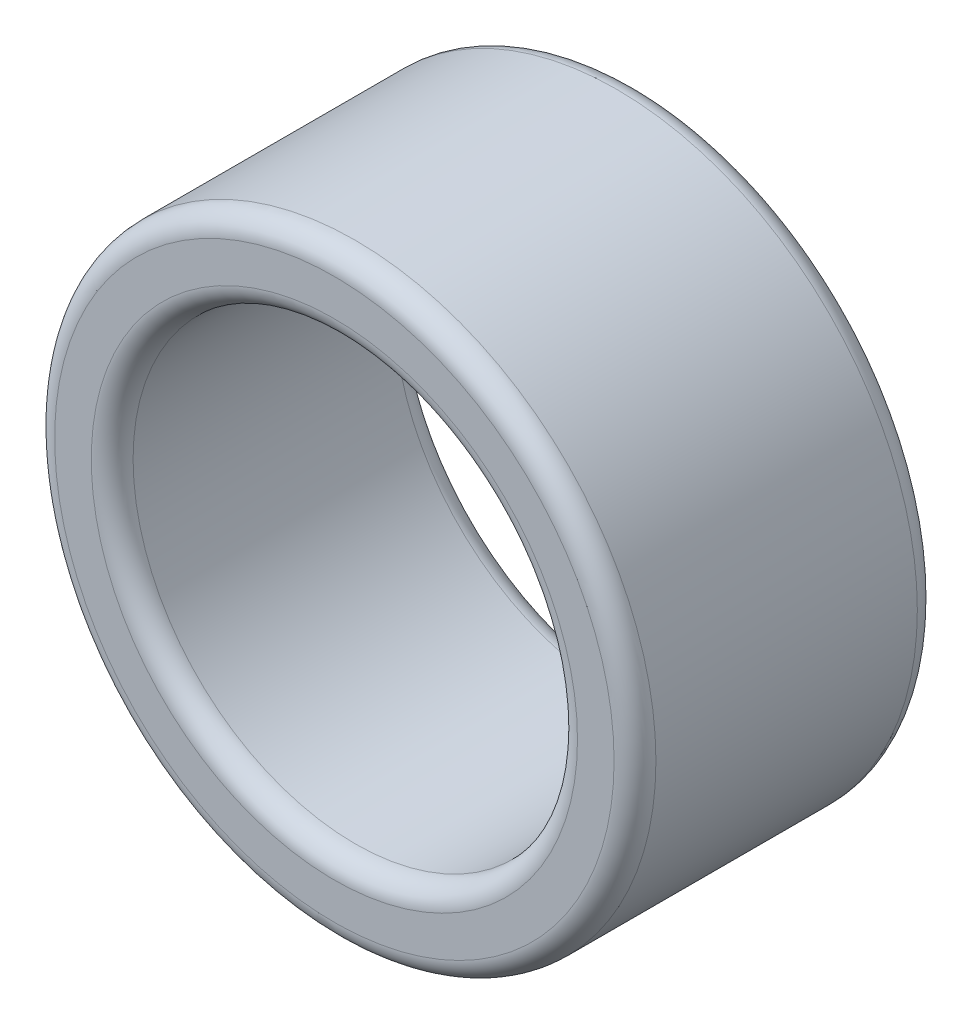
ISO-10303-21;
HEADER;
FILE_DESCRIPTION(('STEP AP214'),'2;1');
FILE_NAME('part.step','',(''),(''),'','','');
FILE_SCHEMA(('AUTOMOTIVE_DESIGN { 1 0 10303 214 1 1 1 1 }'));
ENDSEC;
DATA;
#1=APPLICATION_CONTEXT('core data for automotive mechanical design processes');
#2=APPLICATION_PROTOCOL_DEFINITION('international standard','automotive_design',2000,#1);
#3=PRODUCT_CONTEXT('',#1,'mechanical');
#4=PRODUCT('Part','Part','',(#3));
#5=PRODUCT_RELATED_PRODUCT_CATEGORY('part','',(#4));
#6=PRODUCT_DEFINITION_FORMATION('','',#4);
#7=PRODUCT_DEFINITION_CONTEXT('part definition',#1,'design');
#8=PRODUCT_DEFINITION('design','',#6,#7);
#9=PRODUCT_DEFINITION_SHAPE('','',#8);
#10=(LENGTH_UNIT() NAMED_UNIT(*) SI_UNIT(.MILLI.,.METRE.));
#11=(NAMED_UNIT(*) PLANE_ANGLE_UNIT() SI_UNIT($,.RADIAN.));
#12=(NAMED_UNIT(*) SI_UNIT($,.STERADIAN.) SOLID_ANGLE_UNIT());
#13=UNCERTAINTY_MEASURE_WITH_UNIT(LENGTH_MEASURE(1.E-05),#10,'distance_accuracy_value','');
#14=(GEOMETRIC_REPRESENTATION_CONTEXT(3) GLOBAL_UNCERTAINTY_ASSIGNED_CONTEXT((#13)) GLOBAL_UNIT_ASSIGNED_CONTEXT((#10,
#11,#12)) REPRESENTATION_CONTEXT('',''));
#15=CARTESIAN_POINT('',(0.,0.,0.));
#16=DIRECTION('',(0.,0.,1.));
#17=DIRECTION('',(1.,0.,0.));
#18=AXIS2_PLACEMENT_3D('',#15,#16,#17);
#19=CARTESIAN_POINT('',(0.,0.,29.));
#20=DIRECTION('',(0.,0.,1.));
#21=DIRECTION('',(1.,0.,0.));
#22=AXIS2_PLACEMENT_3D('',#19,#20,#21);
#23=PLANE('',#22);
#24=CARTESIAN_POINT('',(0.,0.,29.));
#25=DIRECTION('',(0.,0.,1.));
#26=DIRECTION('',(1.,0.,0.));
#27=AXIS2_PLACEMENT_3D('',#24,#25,#26);
#28=CIRCLE('',#27,46.5);
#29=CARTESIAN_POINT('',(46.5,0.,29.));
#30=VERTEX_POINT('',#29);
#31=EDGE_CURVE('E10',#30,#30,#28,.F.);
#32=ORIENTED_EDGE('',*,*,#31,.T.);
#33=EDGE_LOOP('',(#32));
#34=FACE_BOUND('',#33,.T.);
#35=CARTESIAN_POINT('',(0.,0.,29.));
#36=DIRECTION('',(0.,0.,1.));
#37=DIRECTION('',(1.,0.,0.));
#38=AXIS2_PLACEMENT_3D('',#35,#36,#37);
#39=CIRCLE('',#38,53.5);
#40=CARTESIAN_POINT('',(53.5,0.,29.));
#41=VERTEX_POINT('',#40);
#42=EDGE_CURVE('E43',#41,#41,#39,.T.);
#43=ORIENTED_EDGE('',*,*,#42,.T.);
#44=EDGE_LOOP('',(#43));
#45=FACE_BOUND('',#44,.T.);
#46=ADVANCED_FACE('F36',(#34,#45),#23,.T.);
#47=CARTESIAN_POINT('',(0.,0.,-29.));
#48=DIRECTION('',(0.,0.,1.));
#49=DIRECTION('',(1.,0.,0.));
#50=AXIS2_PLACEMENT_3D('',#47,#48,#49);
#51=PLANE('',#50);
#52=CARTESIAN_POINT('',(0.,0.,-29.));
#53=DIRECTION('',(0.,0.,1.));
#54=DIRECTION('',(1.,0.,0.));
#55=AXIS2_PLACEMENT_3D('',#52,#53,#54);
#56=CIRCLE('',#55,46.5);
#57=CARTESIAN_POINT('',(46.5,0.,-29.));
#58=VERTEX_POINT('',#57);
#59=EDGE_CURVE('E62',#58,#58,#56,.T.);
#60=ORIENTED_EDGE('',*,*,#59,.T.);
#61=EDGE_LOOP('',(#60));
#62=FACE_BOUND('',#61,.T.);
#63=CARTESIAN_POINT('',(0.,0.,-29.));
#64=DIRECTION('',(0.,0.,1.));
#65=DIRECTION('',(1.,0.,0.));
#66=AXIS2_PLACEMENT_3D('',#63,#64,#65);
#67=CIRCLE('',#66,53.5);
#68=CARTESIAN_POINT('',(53.5,0.,-29.));
#69=VERTEX_POINT('',#68);
#70=EDGE_CURVE('E65',#69,#69,#67,.F.);
#71=ORIENTED_EDGE('',*,*,#70,.T.);
#72=EDGE_LOOP('',(#71));
#73=FACE_BOUND('',#72,.T.);
#74=ADVANCED_FACE('F69',(#62,#73),#51,.F.);
#75=CARTESIAN_POINT('',(0.,0.,29.));
#76=DIRECTION('',(0.,0.,-1.));
#77=DIRECTION('',(-1.,0.,0.));
#78=AXIS2_PLACEMENT_3D('',#75,#76,#77);
#79=CYLINDRICAL_SURFACE('',#78,57.5);
#80=CARTESIAN_POINT('',(0.,0.,-25.));
#81=DIRECTION('',(0.,0.,1.));
#82=DIRECTION('',(1.,0.,0.));
#83=AXIS2_PLACEMENT_3D('',#80,#81,#82);
#84=CIRCLE('',#83,57.5);
#85=CARTESIAN_POINT('',(-57.5,0.,-25.));
#86=VERTEX_POINT('',#85);
#87=EDGE_CURVE('E47',#86,#86,#84,.T.);
#88=CARTESIAN_POINT('',(0.,0.,25.));
#89=DIRECTION('',(0.,0.,1.));
#90=DIRECTION('',(1.,0.,0.));
#91=AXIS2_PLACEMENT_3D('',#88,#89,#90);
#92=CIRCLE('',#91,57.5);
#93=CARTESIAN_POINT('',(-57.5,0.,25.));
#94=VERTEX_POINT('',#93);
#95=EDGE_CURVE('E51',#94,#94,#92,.F.);
#96=CARTESIAN_POINT('',(-57.5,0.,-25.));
#97=CARTESIAN_POINT('',(-57.5,0.,-24.4791666666667));
#98=CARTESIAN_POINT('',(-57.5,0.,-23.9583333333333));
#99=CARTESIAN_POINT('',(-57.5,0.,-22.9166666666667));
#100=CARTESIAN_POINT('',(-57.5,0.,-22.3958333333333));
#101=CARTESIAN_POINT('',(-57.5,0.,-21.3541666666667));
#102=CARTESIAN_POINT('',(-57.5,0.,-20.8333333333333));
#103=CARTESIAN_POINT('',(-57.5,0.,-19.7916666666667));
#104=CARTESIAN_POINT('',(-57.5,0.,-19.2708333333333));
#105=CARTESIAN_POINT('',(-57.5,0.,-18.2291666666667));
#106=CARTESIAN_POINT('',(-57.5,0.,-17.7083333333333));
#107=CARTESIAN_POINT('',(-57.5,0.,-16.6666666666667));
#108=CARTESIAN_POINT('',(-57.5,0.,-16.1458333333333));
#109=CARTESIAN_POINT('',(-57.5,0.,-15.1041666666667));
#110=CARTESIAN_POINT('',(-57.5,0.,-14.5833333333333));
#111=CARTESIAN_POINT('',(-57.5,0.,-13.5416666666667));
#112=CARTESIAN_POINT('',(-57.5,0.,-13.0208333333333));
#113=CARTESIAN_POINT('',(-57.5,0.,-11.9791666666667));
#114=CARTESIAN_POINT('',(-57.5,0.,-11.4583333333333));
#115=CARTESIAN_POINT('',(-57.5,0.,-10.4166666666667));
#116=CARTESIAN_POINT('',(-57.5,0.,-9.89583333333334));
#117=CARTESIAN_POINT('',(-57.5,0.,-8.85416666666667));
#118=CARTESIAN_POINT('',(-57.5,0.,-8.33333333333334));
#119=CARTESIAN_POINT('',(-57.5,0.,-7.29166666666667));
#120=CARTESIAN_POINT('',(-57.5,0.,-6.77083333333334));
#121=CARTESIAN_POINT('',(-57.5,0.,-5.72916666666667));
#122=CARTESIAN_POINT('',(-57.5,0.,-5.20833333333334));
#123=CARTESIAN_POINT('',(-57.5,0.,-4.16666666666667));
#124=CARTESIAN_POINT('',(-57.5,0.,-3.64583333333334));
#125=CARTESIAN_POINT('',(-57.5,0.,-2.60416666666667));
#126=CARTESIAN_POINT('',(-57.5,0.,-2.08333333333334));
#127=CARTESIAN_POINT('',(-57.5,0.,-1.04166666666667));
#128=CARTESIAN_POINT('',(-57.5,0.,-0.520833333333341));
#129=CARTESIAN_POINT('',(-57.5,0.,0.520833333333327));
#130=CARTESIAN_POINT('',(-57.5,0.,1.04166666666666));
#131=CARTESIAN_POINT('',(-57.5,0.,2.08333333333333));
#132=CARTESIAN_POINT('',(-57.5,0.,2.60416666666666));
#133=CARTESIAN_POINT('',(-57.5,0.,3.64583333333333));
#134=CARTESIAN_POINT('',(-57.5,0.,4.16666666666666));
#135=CARTESIAN_POINT('',(-57.5,0.,5.20833333333333));
#136=CARTESIAN_POINT('',(-57.5,0.,5.72916666666666));
#137=CARTESIAN_POINT('',(-57.5,0.,6.77083333333333));
#138=CARTESIAN_POINT('',(-57.5,0.,7.29166666666666));
#139=CARTESIAN_POINT('',(-57.5,0.,8.33333333333333));
#140=CARTESIAN_POINT('',(-57.5,0.,8.85416666666666));
#141=CARTESIAN_POINT('',(-57.5,0.,9.89583333333333));
#142=CARTESIAN_POINT('',(-57.5,0.,10.4166666666667));
#143=CARTESIAN_POINT('',(-57.5,0.,11.4583333333333));
#144=CARTESIAN_POINT('',(-57.5,0.,11.9791666666667));
#145=CARTESIAN_POINT('',(-57.5,0.,13.0208333333333));
#146=CARTESIAN_POINT('',(-57.5,0.,13.5416666666667));
#147=CARTESIAN_POINT('',(-57.5,0.,14.5833333333333));
#148=CARTESIAN_POINT('',(-57.5,0.,15.1041666666667));
#149=CARTESIAN_POINT('',(-57.5,0.,16.1458333333333));
#150=CARTESIAN_POINT('',(-57.5,0.,16.6666666666667));
#151=CARTESIAN_POINT('',(-57.5,0.,17.7083333333333));
#152=CARTESIAN_POINT('',(-57.5,0.,18.2291666666667));
#153=CARTESIAN_POINT('',(-57.5,0.,19.2708333333333));
#154=CARTESIAN_POINT('',(-57.5,0.,19.7916666666667));
#155=CARTESIAN_POINT('',(-57.5,0.,20.8333333333333));
#156=CARTESIAN_POINT('',(-57.5,0.,21.3541666666667));
#157=CARTESIAN_POINT('',(-57.5,0.,22.3958333333333));
#158=CARTESIAN_POINT('',(-57.5,0.,22.9166666666667));
#159=CARTESIAN_POINT('',(-57.5,0.,23.9583333333333));
#160=CARTESIAN_POINT('',(-57.5,0.,24.4791666666667));
#161=CARTESIAN_POINT('',(-57.5,0.,25.));
#162=B_SPLINE_CURVE_WITH_KNOTS('',3,(#96,#97,#98,#99,#100,#101,#102,#103,#104,#105,#106,#107,
#108,#109,#110,#111,#112,#113,#114,#115,#116,#117,#118,#119,#120,#121,#122,#123,#124,#125,#126,
#127,#128,#129,#130,#131,#132,#133,#134,#135,#136,#137,#138,#139,#140,#141,#142,#143,#144,#145,
#146,#147,#148,#149,#150,#151,#152,#153,#154,#155,#156,#157,#158,#159,#160,#161),.UNSPECIFIED.,
.F.,.F.,(4,2,2,2,2,2,2,2,2,2,2,2,2,2,2,2,2,2,2,2,2,2,2,2,2,2,2,2,2,2,2,2,4),(0.,1.5625,3.125,
4.6875,6.25000000000001,7.8125,9.375,10.9375,12.5,14.0625,15.625,17.1875,18.75,20.3125,21.875,
23.4375,25.,26.5625,28.125,29.6875,31.25,32.8125,34.375,35.9375,37.5,39.0625,40.625,42.1875,
43.75,45.3125,46.875,48.4375,50.),.UNSPECIFIED.);
#163=EDGE_CURVE('BSEAM79',#86,#94,#162,.T.);
#164=ORIENTED_EDGE('',*,*,#87,.T.);
#165=ORIENTED_EDGE('',*,*,#95,.T.);
#166=ORIENTED_EDGE('',*,*,#163,.T.);
#167=ORIENTED_EDGE('',*,*,#163,.F.);
#168=EDGE_LOOP('',(#164,#166,#165,#167));
#169=FACE_BOUND('',#168,.T.);
#170=ADVANCED_FACE('F79',(#169),#79,.T.);
#171=CARTESIAN_POINT('',(0.,0.,29.));
#172=DIRECTION('',(0.,0.,-1.));
#173=DIRECTION('',(-1.,0.,0.));
#174=AXIS2_PLACEMENT_3D('',#171,#172,#173);
#175=CYLINDRICAL_SURFACE('',#174,42.5);
#176=CARTESIAN_POINT('',(0.,0.,-25.));
#177=DIRECTION('',(0.,0.,1.));
#178=DIRECTION('',(1.,0.,0.));
#179=AXIS2_PLACEMENT_3D('',#176,#177,#178);
#180=CIRCLE('',#179,42.5);
#181=CARTESIAN_POINT('',(-42.5,0.,-25.));
#182=VERTEX_POINT('',#181);
#183=EDGE_CURVE('E56',#182,#182,#180,.F.);
#184=CARTESIAN_POINT('',(0.,0.,25.));
#185=DIRECTION('',(0.,0.,1.));
#186=DIRECTION('',(1.,0.,0.));
#187=AXIS2_PLACEMENT_3D('',#184,#185,#186);
#188=CIRCLE('',#187,42.5);
#189=CARTESIAN_POINT('',(-42.5,0.,25.));
#190=VERTEX_POINT('',#189);
#191=EDGE_CURVE('E59',#190,#190,#188,.T.);
#192=CARTESIAN_POINT('',(-42.5,0.,-25.));
#193=CARTESIAN_POINT('',(-42.5,0.,-24.4791666666667));
#194=CARTESIAN_POINT('',(-42.5,0.,-23.9583333333333));
#195=CARTESIAN_POINT('',(-42.5,0.,-22.9166666666667));
#196=CARTESIAN_POINT('',(-42.5,0.,-22.3958333333333));
#197=CARTESIAN_POINT('',(-42.5,0.,-21.3541666666667));
#198=CARTESIAN_POINT('',(-42.5,0.,-20.8333333333333));
#199=CARTESIAN_POINT('',(-42.5,0.,-19.7916666666667));
#200=CARTESIAN_POINT('',(-42.5,0.,-19.2708333333333));
#201=CARTESIAN_POINT('',(-42.5,0.,-18.2291666666667));
#202=CARTESIAN_POINT('',(-42.5,0.,-17.7083333333333));
#203=CARTESIAN_POINT('',(-42.5,0.,-16.6666666666667));
#204=CARTESIAN_POINT('',(-42.5,0.,-16.1458333333333));
#205=CARTESIAN_POINT('',(-42.5,0.,-15.1041666666667));
#206=CARTESIAN_POINT('',(-42.5,0.,-14.5833333333333));
#207=CARTESIAN_POINT('',(-42.5,0.,-13.5416666666667));
#208=CARTESIAN_POINT('',(-42.5,0.,-13.0208333333333));
#209=CARTESIAN_POINT('',(-42.5,0.,-11.9791666666667));
#210=CARTESIAN_POINT('',(-42.5,0.,-11.4583333333333));
#211=CARTESIAN_POINT('',(-42.5,0.,-10.4166666666667));
#212=CARTESIAN_POINT('',(-42.5,0.,-9.89583333333334));
#213=CARTESIAN_POINT('',(-42.5,0.,-8.85416666666667));
#214=CARTESIAN_POINT('',(-42.5,0.,-8.33333333333334));
#215=CARTESIAN_POINT('',(-42.5,0.,-7.29166666666667));
#216=CARTESIAN_POINT('',(-42.5,0.,-6.77083333333334));
#217=CARTESIAN_POINT('',(-42.5,0.,-5.72916666666667));
#218=CARTESIAN_POINT('',(-42.5,0.,-5.20833333333334));
#219=CARTESIAN_POINT('',(-42.5,0.,-4.16666666666667));
#220=CARTESIAN_POINT('',(-42.5,0.,-3.64583333333334));
#221=CARTESIAN_POINT('',(-42.5,0.,-2.60416666666667));
#222=CARTESIAN_POINT('',(-42.5,0.,-2.08333333333334));
#223=CARTESIAN_POINT('',(-42.5,0.,-1.04166666666667));
#224=CARTESIAN_POINT('',(-42.5,0.,-0.520833333333341));
#225=CARTESIAN_POINT('',(-42.5,0.,0.520833333333327));
#226=CARTESIAN_POINT('',(-42.5,0.,1.04166666666666));
#227=CARTESIAN_POINT('',(-42.5,0.,2.08333333333333));
#228=CARTESIAN_POINT('',(-42.5,0.,2.60416666666666));
#229=CARTESIAN_POINT('',(-42.5,0.,3.64583333333333));
#230=CARTESIAN_POINT('',(-42.5,0.,4.16666666666666));
#231=CARTESIAN_POINT('',(-42.5,0.,5.20833333333333));
#232=CARTESIAN_POINT('',(-42.5,0.,5.72916666666666));
#233=CARTESIAN_POINT('',(-42.5,0.,6.77083333333333));
#234=CARTESIAN_POINT('',(-42.5,0.,7.29166666666666));
#235=CARTESIAN_POINT('',(-42.5,0.,8.33333333333333));
#236=CARTESIAN_POINT('',(-42.5,0.,8.85416666666666));
#237=CARTESIAN_POINT('',(-42.5,0.,9.89583333333333));
#238=CARTESIAN_POINT('',(-42.5,0.,10.4166666666667));
#239=CARTESIAN_POINT('',(-42.5,0.,11.4583333333333));
#240=CARTESIAN_POINT('',(-42.5,0.,11.9791666666667));
#241=CARTESIAN_POINT('',(-42.5,0.,13.0208333333333));
#242=CARTESIAN_POINT('',(-42.5,0.,13.5416666666667));
#243=CARTESIAN_POINT('',(-42.5,0.,14.5833333333333));
#244=CARTESIAN_POINT('',(-42.5,0.,15.1041666666667));
#245=CARTESIAN_POINT('',(-42.5,0.,16.1458333333333));
#246=CARTESIAN_POINT('',(-42.5,0.,16.6666666666667));
#247=CARTESIAN_POINT('',(-42.5,0.,17.7083333333333));
#248=CARTESIAN_POINT('',(-42.5,0.,18.2291666666667));
#249=CARTESIAN_POINT('',(-42.5,0.,19.2708333333333));
#250=CARTESIAN_POINT('',(-42.5,0.,19.7916666666667));
#251=CARTESIAN_POINT('',(-42.5,0.,20.8333333333333));
#252=CARTESIAN_POINT('',(-42.5,0.,21.3541666666667));
#253=CARTESIAN_POINT('',(-42.5,0.,22.3958333333333));
#254=CARTESIAN_POINT('',(-42.5,0.,22.9166666666667));
#255=CARTESIAN_POINT('',(-42.5,0.,23.9583333333333));
#256=CARTESIAN_POINT('',(-42.5,0.,24.4791666666667));
#257=CARTESIAN_POINT('',(-42.5,0.,25.));
#258=B_SPLINE_CURVE_WITH_KNOTS('',3,(#192,#193,#194,#195,#196,#197,#198,#199,#200,#201,#202,
#203,#204,#205,#206,#207,#208,#209,#210,#211,#212,#213,#214,#215,#216,#217,#218,#219,#220,#221,
#222,#223,#224,#225,#226,#227,#228,#229,#230,#231,#232,#233,#234,#235,#236,#237,#238,#239,#240,
#241,#242,#243,#244,#245,#246,#247,#248,#249,#250,#251,#252,#253,#254,#255,#256,#257),
.UNSPECIFIED.,.F.,.F.,(4,2,2,2,2,2,2,2,2,2,2,2,2,2,2,2,2,2,2,2,2,2,2,2,2,2,2,2,2,2,2,2,4),(0.,
1.5625,3.125,4.6875,6.25000000000001,7.8125,9.375,10.9375,12.5,14.0625,15.625,17.1875,18.75,
20.3125,21.875,23.4375,25.,26.5625,28.125,29.6875,31.25,32.8125,34.375,35.9375,37.5,39.0625,
40.625,42.1875,43.75,45.3125,46.875,48.4375,50.),.UNSPECIFIED.);
#259=EDGE_CURVE('BSEAM82',#182,#190,#258,.T.);
#260=ORIENTED_EDGE('',*,*,#183,.T.);
#261=ORIENTED_EDGE('',*,*,#191,.T.);
#262=ORIENTED_EDGE('',*,*,#259,.T.);
#263=ORIENTED_EDGE('',*,*,#259,.F.);
#264=EDGE_LOOP('',(#260,#262,#261,#263));
#265=FACE_BOUND('',#264,.T.);
#266=ADVANCED_FACE('F82',(#265),#175,.F.);
#267=CARTESIAN_POINT('',(0.,0.,-25.));
#268=DIRECTION('',(0.,0.,1.));
#269=DIRECTION('',(1.,0.,0.));
#270=AXIS2_PLACEMENT_3D('',#267,#268,#269);
#271=TOROIDAL_SURFACE('',#270,46.5,4.);
#272=ORIENTED_EDGE('',*,*,#183,.F.);
#273=EDGE_LOOP('',(#272));
#274=FACE_BOUND('',#273,.T.);
#275=ORIENTED_EDGE('',*,*,#59,.F.);
#276=EDGE_LOOP('',(#275));
#277=FACE_BOUND('',#276,.T.);
#278=ADVANCED_FACE('F75',(#274,#277),#271,.T.);
#279=CARTESIAN_POINT('',(0.,0.,-25.));
#280=DIRECTION('',(0.,0.,1.));
#281=DIRECTION('',(1.,0.,0.));
#282=AXIS2_PLACEMENT_3D('',#279,#280,#281);
#283=TOROIDAL_SURFACE('',#282,53.5,4.);
#284=ORIENTED_EDGE('',*,*,#70,.F.);
#285=EDGE_LOOP('',(#284));
#286=FACE_BOUND('',#285,.T.);
#287=ORIENTED_EDGE('',*,*,#87,.F.);
#288=EDGE_LOOP('',(#287));
#289=FACE_BOUND('',#288,.T.);
#290=ADVANCED_FACE('F71',(#286,#289),#283,.T.);
#291=CARTESIAN_POINT('',(0.,0.,25.));
#292=DIRECTION('',(0.,0.,1.));
#293=DIRECTION('',(1.,0.,0.));
#294=AXIS2_PLACEMENT_3D('',#291,#292,#293);
#295=TOROIDAL_SURFACE('',#294,46.5,4.);
#296=ORIENTED_EDGE('',*,*,#31,.F.);
#297=EDGE_LOOP('',(#296));
#298=FACE_BOUND('',#297,.T.);
#299=ORIENTED_EDGE('',*,*,#191,.F.);
#300=EDGE_LOOP('',(#299));
#301=FACE_BOUND('',#300,.T.);
#302=ADVANCED_FACE('F74',(#298,#301),#295,.T.);
#303=CARTESIAN_POINT('',(0.,0.,25.));
#304=DIRECTION('',(0.,0.,1.));
#305=DIRECTION('',(1.,0.,0.));
#306=AXIS2_PLACEMENT_3D('',#303,#304,#305);
#307=TOROIDAL_SURFACE('',#306,53.5,4.);
#308=ORIENTED_EDGE('',*,*,#95,.F.);
#309=EDGE_LOOP('',(#308));
#310=FACE_BOUND('',#309,.T.);
#311=ORIENTED_EDGE('',*,*,#42,.F.);
#312=EDGE_LOOP('',(#311));
#313=FACE_BOUND('',#312,.T.);
#314=ADVANCED_FACE('F38',(#310,#313),#307,.T.);
#315=CLOSED_SHELL('',(#46,#74,#170,#266,#278,#290,#302,#314));
#316=MANIFOLD_SOLID_BREP('B2',#315);
#317=ADVANCED_BREP_SHAPE_REPRESENTATION('',(#18,#316),#14);
#318=SHAPE_DEFINITION_REPRESENTATION(#9,#317);
ENDSEC;
END-ISO-10303-21;
